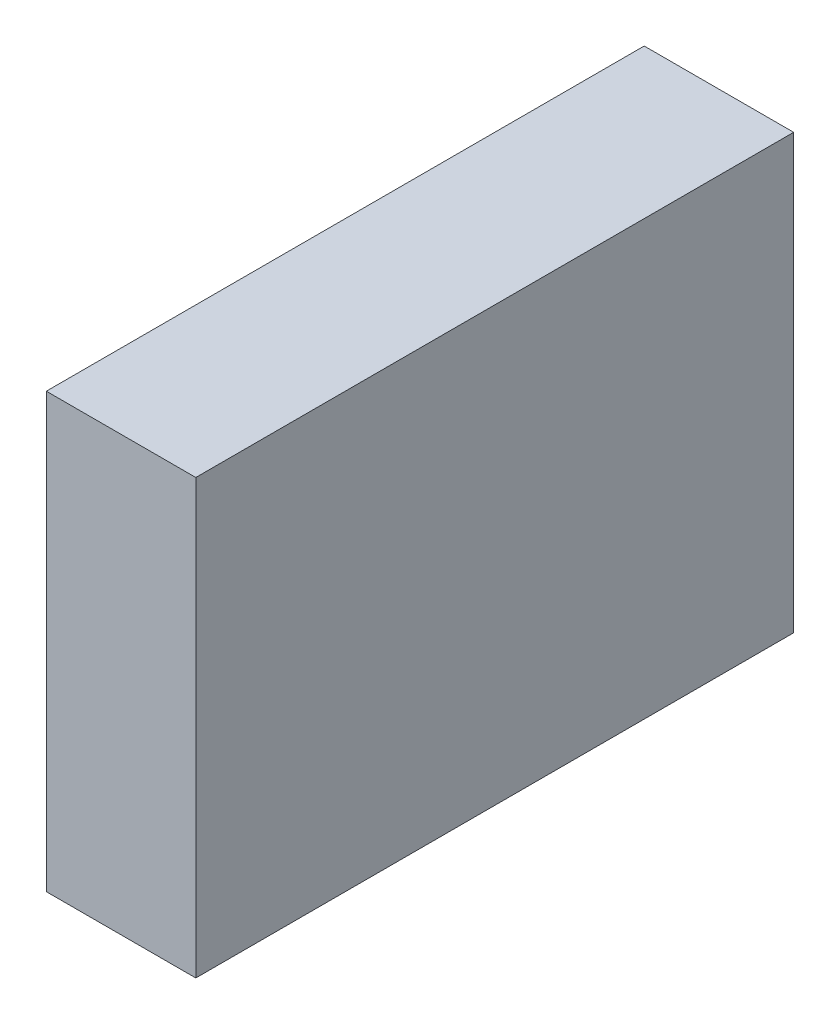
ISO-10303-21;
HEADER;
FILE_DESCRIPTION(('STEP AP214'),'2;1');
FILE_NAME('part.step','',(''),(''),'','','');
FILE_SCHEMA(('AUTOMOTIVE_DESIGN { 1 0 10303 214 1 1 1 1 }'));
ENDSEC;
DATA;
#1=APPLICATION_CONTEXT('core data for automotive mechanical design processes');
#2=APPLICATION_PROTOCOL_DEFINITION('international standard','automotive_design',2000,#1);
#3=PRODUCT_CONTEXT('',#1,'mechanical');
#4=PRODUCT('Part','Part','',(#3));
#5=PRODUCT_RELATED_PRODUCT_CATEGORY('part','',(#4));
#6=PRODUCT_DEFINITION_FORMATION('','',#4);
#7=PRODUCT_DEFINITION_CONTEXT('part definition',#1,'design');
#8=PRODUCT_DEFINITION('design','',#6,#7);
#9=PRODUCT_DEFINITION_SHAPE('','',#8);
#10=(LENGTH_UNIT() NAMED_UNIT(*) SI_UNIT(.MILLI.,.METRE.));
#11=(NAMED_UNIT(*) PLANE_ANGLE_UNIT() SI_UNIT($,.RADIAN.));
#12=(NAMED_UNIT(*) SI_UNIT($,.STERADIAN.) SOLID_ANGLE_UNIT());
#13=UNCERTAINTY_MEASURE_WITH_UNIT(LENGTH_MEASURE(1.E-05),#10,'distance_accuracy_value','');
#14=(GEOMETRIC_REPRESENTATION_CONTEXT(3) GLOBAL_UNCERTAINTY_ASSIGNED_CONTEXT((#13)) GLOBAL_UNIT_ASSIGNED_CONTEXT((#10,
#11,#12)) REPRESENTATION_CONTEXT('',''));
#15=CARTESIAN_POINT('',(0.,0.,0.));
#16=DIRECTION('',(0.,0.,1.));
#17=DIRECTION('',(1.,0.,0.));
#18=AXIS2_PLACEMENT_3D('',#15,#16,#17);
#19=CARTESIAN_POINT('',(-10.,0.,0.));
#20=DIRECTION('',(0.,0.,1.));
#21=DIRECTION('',(1.,0.,0.));
#22=AXIS2_PLACEMENT_3D('',#19,#20,#21);
#23=PLANE('',#22);
#24=DIRECTION('',(0.,-1.,0.));
#25=VECTOR('',#24,1.);
#26=CARTESIAN_POINT('',(0.,0.,0.));
#27=LINE('',#26,#25);
#28=CARTESIAN_POINT('',(0.,29.,0.));
#29=VERTEX_POINT('',#28);
#30=CARTESIAN_POINT('',(0.,0.,0.));
#31=VERTEX_POINT('',#30);
#32=EDGE_CURVE('E104',#29,#31,#27,.T.);
#33=ORIENTED_EDGE('',*,*,#32,.F.);
#34=DIRECTION('',(1.,0.,0.));
#35=VECTOR('',#34,1.);
#36=CARTESIAN_POINT('',(-10.,29.,0.));
#37=LINE('',#36,#35);
#38=CARTESIAN_POINT('',(-10.,29.,0.));
#39=VERTEX_POINT('',#38);
#40=EDGE_CURVE('E11',#39,#29,#37,.T.);
#41=ORIENTED_EDGE('',*,*,#40,.F.);
#42=DIRECTION('',(0.,-1.,0.));
#43=VECTOR('',#42,1.);
#44=CARTESIAN_POINT('',(-10.,0.,0.));
#45=LINE('',#44,#43);
#46=CARTESIAN_POINT('',(-10.,0.,0.));
#47=VERTEX_POINT('',#46);
#48=EDGE_CURVE('E100',#39,#47,#45,.T.);
#49=ORIENTED_EDGE('',*,*,#48,.T.);
#50=DIRECTION('',(1.,0.,0.));
#51=VECTOR('',#50,1.);
#52=CARTESIAN_POINT('',(-10.,0.,0.));
#53=LINE('',#52,#51);
#54=EDGE_CURVE('E45',#47,#31,#53,.T.);
#55=ORIENTED_EDGE('',*,*,#54,.T.);
#56=EDGE_LOOP('',(#33,#41,#49,#55));
#57=FACE_BOUND('',#56,.T.);
#58=ADVANCED_FACE('F39',(#57),#23,.T.);
#59=CARTESIAN_POINT('',(-10.,29.,0.));
#60=DIRECTION('',(0.,1.,0.));
#61=DIRECTION('',(0.,0.,1.));
#62=AXIS2_PLACEMENT_3D('',#59,#60,#61);
#63=PLANE('',#62);
#64=DIRECTION('',(0.,0.,1.));
#65=VECTOR('',#64,1.);
#66=CARTESIAN_POINT('',(0.,29.,0.));
#67=LINE('',#66,#65);
#68=CARTESIAN_POINT('',(0.,29.,-40.));
#69=VERTEX_POINT('',#68);
#70=EDGE_CURVE('E98',#69,#29,#67,.T.);
#71=ORIENTED_EDGE('',*,*,#70,.F.);
#72=DIRECTION('',(1.,0.,0.));
#73=VECTOR('',#72,1.);
#74=CARTESIAN_POINT('',(-10.,29.,-40.));
#75=LINE('',#74,#73);
#76=CARTESIAN_POINT('',(-10.,29.,-40.));
#77=VERTEX_POINT('',#76);
#78=EDGE_CURVE('E48',#77,#69,#75,.T.);
#79=ORIENTED_EDGE('',*,*,#78,.F.);
#80=DIRECTION('',(0.,0.,1.));
#81=VECTOR('',#80,1.);
#82=CARTESIAN_POINT('',(-10.,29.,0.));
#83=LINE('',#82,#81);
#84=EDGE_CURVE('E92',#77,#39,#83,.T.);
#85=ORIENTED_EDGE('',*,*,#84,.T.);
#86=ORIENTED_EDGE('',*,*,#40,.T.);
#87=EDGE_LOOP('',(#71,#79,#85,#86));
#88=FACE_BOUND('',#87,.T.);
#89=ADVANCED_FACE('F111',(#88),#63,.T.);
#90=CARTESIAN_POINT('',(-10.,0.,-40.));
#91=DIRECTION('',(0.,0.,-1.));
#92=DIRECTION('',(-1.,0.,0.));
#93=AXIS2_PLACEMENT_3D('',#90,#91,#92);
#94=PLANE('',#93);
#95=DIRECTION('',(0.,1.,0.));
#96=VECTOR('',#95,1.);
#97=CARTESIAN_POINT('',(0.,0.,-40.));
#98=LINE('',#97,#96);
#99=CARTESIAN_POINT('',(0.,0.,-40.));
#100=VERTEX_POINT('',#99);
#101=EDGE_CURVE('E87',#100,#69,#98,.T.);
#102=ORIENTED_EDGE('',*,*,#101,.F.);
#103=DIRECTION('',(1.,0.,0.));
#104=VECTOR('',#103,1.);
#105=CARTESIAN_POINT('',(-10.,0.,-40.));
#106=LINE('',#105,#104);
#107=CARTESIAN_POINT('',(-10.,0.,-40.));
#108=VERTEX_POINT('',#107);
#109=EDGE_CURVE('E84',#108,#100,#106,.T.);
#110=ORIENTED_EDGE('',*,*,#109,.F.);
#111=DIRECTION('',(0.,1.,0.));
#112=VECTOR('',#111,1.);
#113=CARTESIAN_POINT('',(-10.,0.,-40.));
#114=LINE('',#113,#112);
#115=EDGE_CURVE('E90',#108,#77,#114,.T.);
#116=ORIENTED_EDGE('',*,*,#115,.T.);
#117=ORIENTED_EDGE('',*,*,#78,.T.);
#118=EDGE_LOOP('',(#102,#110,#116,#117));
#119=FACE_BOUND('',#118,.T.);
#120=ADVANCED_FACE('F86',(#119),#94,.T.);
#121=CARTESIAN_POINT('',(-10.,0.,0.));
#122=DIRECTION('',(0.,-1.,0.));
#123=DIRECTION('',(0.,0.,-1.));
#124=AXIS2_PLACEMENT_3D('',#121,#122,#123);
#125=PLANE('',#124);
#126=DIRECTION('',(0.,0.,-1.));
#127=VECTOR('',#126,1.);
#128=CARTESIAN_POINT('',(0.,0.,0.));
#129=LINE('',#128,#127);
#130=EDGE_CURVE('E106',#31,#100,#129,.T.);
#131=ORIENTED_EDGE('',*,*,#130,.F.);
#132=ORIENTED_EDGE('',*,*,#54,.F.);
#133=DIRECTION('',(0.,0.,-1.));
#134=VECTOR('',#133,1.);
#135=CARTESIAN_POINT('',(-10.,0.,0.));
#136=LINE('',#135,#134);
#137=EDGE_CURVE('E93',#47,#108,#136,.T.);
#138=ORIENTED_EDGE('',*,*,#137,.T.);
#139=ORIENTED_EDGE('',*,*,#109,.T.);
#140=EDGE_LOOP('',(#131,#132,#138,#139));
#141=FACE_BOUND('',#140,.T.);
#142=ADVANCED_FACE('F96',(#141),#125,.T.);
#143=CARTESIAN_POINT('',(-10.,0.,0.));
#144=DIRECTION('',(-1.,0.,0.));
#145=DIRECTION('',(0.,0.,1.));
#146=AXIS2_PLACEMENT_3D('',#143,#144,#145);
#147=PLANE('',#146);
#148=ORIENTED_EDGE('',*,*,#48,.F.);
#149=ORIENTED_EDGE('',*,*,#84,.F.);
#150=ORIENTED_EDGE('',*,*,#115,.F.);
#151=ORIENTED_EDGE('',*,*,#137,.F.);
#152=EDGE_LOOP('',(#148,#149,#150,#151));
#153=FACE_BOUND('',#152,.T.);
#154=ADVANCED_FACE('F95',(#153),#147,.T.);
#155=CARTESIAN_POINT('',(0.,0.,0.));
#156=DIRECTION('',(-1.,0.,0.));
#157=DIRECTION('',(0.,0.,1.));
#158=AXIS2_PLACEMENT_3D('',#155,#156,#157);
#159=PLANE('',#158);
#160=ORIENTED_EDGE('',*,*,#32,.T.);
#161=ORIENTED_EDGE('',*,*,#130,.T.);
#162=ORIENTED_EDGE('',*,*,#101,.T.);
#163=ORIENTED_EDGE('',*,*,#70,.T.);
#164=EDGE_LOOP('',(#160,#161,#162,#163));
#165=FACE_BOUND('',#164,.T.);
#166=ADVANCED_FACE('F115',(#165),#159,.F.);
#167=CLOSED_SHELL('',(#58,#89,#120,#142,#154,#166));
#168=MANIFOLD_SOLID_BREP('B2',#167);
#169=ADVANCED_BREP_SHAPE_REPRESENTATION('',(#18,#168),#14);
#170=SHAPE_DEFINITION_REPRESENTATION(#9,#169);
ENDSEC;
END-ISO-10303-21;
